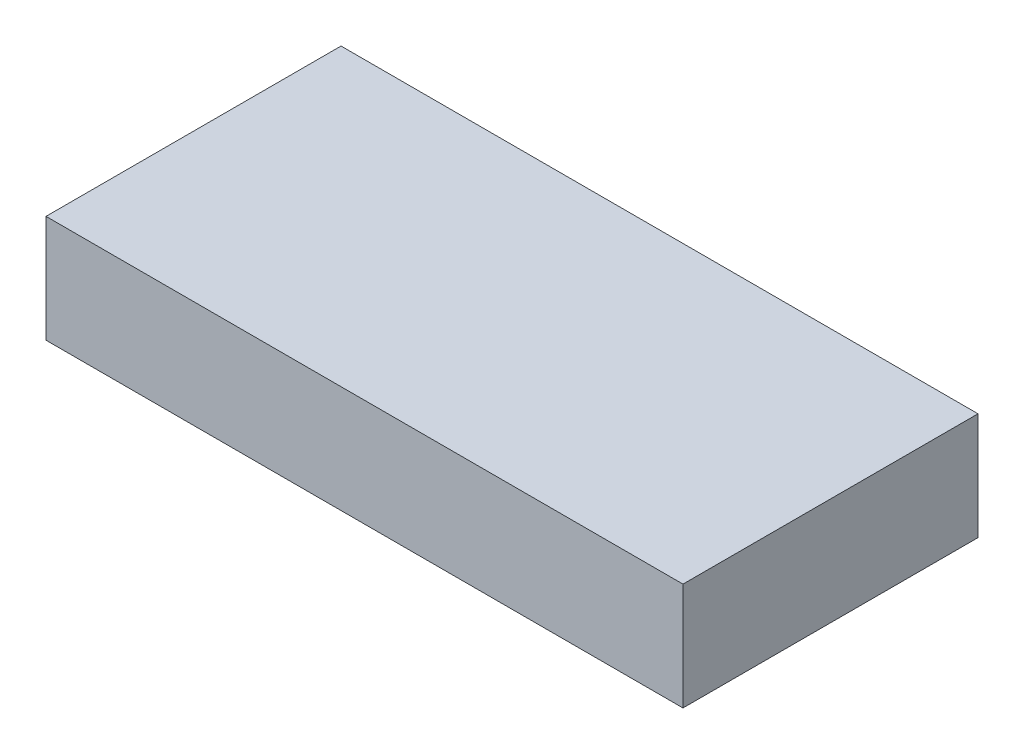
ISO-10303-21;
HEADER;
FILE_DESCRIPTION(('STEP AP214'),'2;1');
FILE_NAME('part.step','',(''),(''),'','','');
FILE_SCHEMA(('AUTOMOTIVE_DESIGN { 1 0 10303 214 1 1 1 1 }'));
ENDSEC;
DATA;
#1=APPLICATION_CONTEXT('core data for automotive mechanical design processes');
#2=APPLICATION_PROTOCOL_DEFINITION('international standard','automotive_design',2000,#1);
#3=PRODUCT_CONTEXT('',#1,'mechanical');
#4=PRODUCT('Part','Part','',(#3));
#5=PRODUCT_RELATED_PRODUCT_CATEGORY('part','',(#4));
#6=PRODUCT_DEFINITION_FORMATION('','',#4);
#7=PRODUCT_DEFINITION_CONTEXT('part definition',#1,'design');
#8=PRODUCT_DEFINITION('design','',#6,#7);
#9=PRODUCT_DEFINITION_SHAPE('','',#8);
#10=(LENGTH_UNIT() NAMED_UNIT(*) SI_UNIT(.MILLI.,.METRE.));
#11=(NAMED_UNIT(*) PLANE_ANGLE_UNIT() SI_UNIT($,.RADIAN.));
#12=(NAMED_UNIT(*) SI_UNIT($,.STERADIAN.) SOLID_ANGLE_UNIT());
#13=UNCERTAINTY_MEASURE_WITH_UNIT(LENGTH_MEASURE(1.E-05),#10,'distance_accuracy_value','');
#14=(GEOMETRIC_REPRESENTATION_CONTEXT(3) GLOBAL_UNCERTAINTY_ASSIGNED_CONTEXT((#13)) GLOBAL_UNIT_ASSIGNED_CONTEXT((#10,
#11,#12)) REPRESENTATION_CONTEXT('',''));
#15=CARTESIAN_POINT('',(0.,0.,0.));
#16=DIRECTION('',(0.,0.,1.));
#17=DIRECTION('',(1.,0.,0.));
#18=AXIS2_PLACEMENT_3D('',#15,#16,#17);
#19=CARTESIAN_POINT('',(47.5,16.,22.));
#20=DIRECTION('',(-1.,0.,0.));
#21=DIRECTION('',(0.,0.,1.));
#22=AXIS2_PLACEMENT_3D('',#19,#20,#21);
#23=PLANE('',#22);
#24=DIRECTION('',(0.,0.,-1.));
#25=VECTOR('',#24,1.);
#26=CARTESIAN_POINT('',(47.5,0.,22.));
#27=LINE('',#26,#25);
#28=CARTESIAN_POINT('',(47.5,0.,22.));
#29=VERTEX_POINT('',#28);
#30=CARTESIAN_POINT('',(47.5,0.,-22.));
#31=VERTEX_POINT('',#30);
#32=EDGE_CURVE('E102',#29,#31,#27,.T.);
#33=ORIENTED_EDGE('',*,*,#32,.T.);
#34=DIRECTION('',(0.,-1.,0.));
#35=VECTOR('',#34,1.);
#36=CARTESIAN_POINT('',(47.5,16.,-22.));
#37=LINE('',#36,#35);
#38=CARTESIAN_POINT('',(47.5,16.,-22.));
#39=VERTEX_POINT('',#38);
#40=EDGE_CURVE('E11',#39,#31,#37,.T.);
#41=ORIENTED_EDGE('',*,*,#40,.F.);
#42=DIRECTION('',(0.,0.,-1.));
#43=VECTOR('',#42,1.);
#44=CARTESIAN_POINT('',(47.5,16.,22.));
#45=LINE('',#44,#43);
#46=CARTESIAN_POINT('',(47.5,16.,22.));
#47=VERTEX_POINT('',#46);
#48=EDGE_CURVE('E90',#47,#39,#45,.T.);
#49=ORIENTED_EDGE('',*,*,#48,.F.);
#50=DIRECTION('',(0.,-1.,0.));
#51=VECTOR('',#50,1.);
#52=CARTESIAN_POINT('',(47.5,16.,22.));
#53=LINE('',#52,#51);
#54=EDGE_CURVE('E98',#47,#29,#53,.T.);
#55=ORIENTED_EDGE('',*,*,#54,.T.);
#56=EDGE_LOOP('',(#33,#41,#49,#55));
#57=FACE_BOUND('',#56,.T.);
#58=ADVANCED_FACE('F39',(#57),#23,.F.);
#59=CARTESIAN_POINT('',(-47.5,16.,-22.));
#60=DIRECTION('',(0.,0.,1.));
#61=DIRECTION('',(1.,0.,0.));
#62=AXIS2_PLACEMENT_3D('',#59,#60,#61);
#63=PLANE('',#62);
#64=DIRECTION('',(-1.,0.,0.));
#65=VECTOR('',#64,1.);
#66=CARTESIAN_POINT('',(-47.5,0.,-22.));
#67=LINE('',#66,#65);
#68=CARTESIAN_POINT('',(-47.5,0.,-22.));
#69=VERTEX_POINT('',#68);
#70=EDGE_CURVE('E94',#31,#69,#67,.T.);
#71=ORIENTED_EDGE('',*,*,#70,.T.);
#72=DIRECTION('',(0.,-1.,0.));
#73=VECTOR('',#72,1.);
#74=CARTESIAN_POINT('',(-47.5,16.,-22.));
#75=LINE('',#74,#73);
#76=CARTESIAN_POINT('',(-47.5,16.,-22.));
#77=VERTEX_POINT('',#76);
#78=EDGE_CURVE('E47',#77,#69,#75,.T.);
#79=ORIENTED_EDGE('',*,*,#78,.F.);
#80=DIRECTION('',(-1.,0.,0.));
#81=VECTOR('',#80,1.);
#82=CARTESIAN_POINT('',(-47.5,16.,-22.));
#83=LINE('',#82,#81);
#84=EDGE_CURVE('E85',#39,#77,#83,.T.);
#85=ORIENTED_EDGE('',*,*,#84,.F.);
#86=ORIENTED_EDGE('',*,*,#40,.T.);
#87=EDGE_LOOP('',(#71,#79,#85,#86));
#88=FACE_BOUND('',#87,.T.);
#89=ADVANCED_FACE('F93',(#88),#63,.F.);
#90=CARTESIAN_POINT('',(-47.5,16.,22.));
#91=DIRECTION('',(1.,0.,0.));
#92=DIRECTION('',(0.,0.,-1.));
#93=AXIS2_PLACEMENT_3D('',#90,#91,#92);
#94=PLANE('',#93);
#95=DIRECTION('',(0.,0.,1.));
#96=VECTOR('',#95,1.);
#97=CARTESIAN_POINT('',(-47.5,0.,22.));
#98=LINE('',#97,#96);
#99=CARTESIAN_POINT('',(-47.5,0.,22.));
#100=VERTEX_POINT('',#99);
#101=EDGE_CURVE('E72',#69,#100,#98,.T.);
#102=ORIENTED_EDGE('',*,*,#101,.T.);
#103=DIRECTION('',(0.,-1.,0.));
#104=VECTOR('',#103,1.);
#105=CARTESIAN_POINT('',(-47.5,16.,22.));
#106=LINE('',#105,#104);
#107=CARTESIAN_POINT('',(-47.5,16.,22.));
#108=VERTEX_POINT('',#107);
#109=EDGE_CURVE('E95',#108,#100,#106,.T.);
#110=ORIENTED_EDGE('',*,*,#109,.F.);
#111=DIRECTION('',(0.,0.,1.));
#112=VECTOR('',#111,1.);
#113=CARTESIAN_POINT('',(-47.5,16.,22.));
#114=LINE('',#113,#112);
#115=EDGE_CURVE('E88',#77,#108,#114,.T.);
#116=ORIENTED_EDGE('',*,*,#115,.F.);
#117=ORIENTED_EDGE('',*,*,#78,.T.);
#118=EDGE_LOOP('',(#102,#110,#116,#117));
#119=FACE_BOUND('',#118,.T.);
#120=ADVANCED_FACE('F96',(#119),#94,.F.);
#121=CARTESIAN_POINT('',(-47.5,16.,22.));
#122=DIRECTION('',(0.,0.,-1.));
#123=DIRECTION('',(-1.,0.,0.));
#124=AXIS2_PLACEMENT_3D('',#121,#122,#123);
#125=PLANE('',#124);
#126=DIRECTION('',(1.,0.,0.));
#127=VECTOR('',#126,1.);
#128=CARTESIAN_POINT('',(-47.5,0.,22.));
#129=LINE('',#128,#127);
#130=EDGE_CURVE('E78',#100,#29,#129,.T.);
#131=ORIENTED_EDGE('',*,*,#130,.T.);
#132=ORIENTED_EDGE('',*,*,#54,.F.);
#133=DIRECTION('',(1.,0.,0.));
#134=VECTOR('',#133,1.);
#135=CARTESIAN_POINT('',(-47.5,16.,22.));
#136=LINE('',#135,#134);
#137=EDGE_CURVE('E55',#108,#47,#136,.T.);
#138=ORIENTED_EDGE('',*,*,#137,.F.);
#139=ORIENTED_EDGE('',*,*,#109,.T.);
#140=EDGE_LOOP('',(#131,#132,#138,#139));
#141=FACE_BOUND('',#140,.T.);
#142=ADVANCED_FACE('F109',(#141),#125,.F.);
#143=CARTESIAN_POINT('',(0.,16.,0.));
#144=DIRECTION('',(0.,-1.,0.));
#145=DIRECTION('',(0.,0.,-1.));
#146=AXIS2_PLACEMENT_3D('',#143,#144,#145);
#147=PLANE('',#146);
#148=ORIENTED_EDGE('',*,*,#48,.T.);
#149=ORIENTED_EDGE('',*,*,#84,.T.);
#150=ORIENTED_EDGE('',*,*,#115,.T.);
#151=ORIENTED_EDGE('',*,*,#137,.T.);
#152=EDGE_LOOP('',(#148,#149,#150,#151));
#153=FACE_BOUND('',#152,.T.);
#154=ADVANCED_FACE('F86',(#153),#147,.F.);
#155=CARTESIAN_POINT('',(0.,0.,0.));
#156=DIRECTION('',(0.,-1.,0.));
#157=DIRECTION('',(0.,0.,-1.));
#158=AXIS2_PLACEMENT_3D('',#155,#156,#157);
#159=PLANE('',#158);
#160=ORIENTED_EDGE('',*,*,#32,.F.);
#161=ORIENTED_EDGE('',*,*,#130,.F.);
#162=ORIENTED_EDGE('',*,*,#101,.F.);
#163=ORIENTED_EDGE('',*,*,#70,.F.);
#164=EDGE_LOOP('',(#160,#161,#162,#163));
#165=FACE_BOUND('',#164,.T.);
#166=ADVANCED_FACE('F112',(#165),#159,.T.);
#167=CLOSED_SHELL('',(#58,#89,#120,#142,#154,#166));
#168=MANIFOLD_SOLID_BREP('B2',#167);
#169=ADVANCED_BREP_SHAPE_REPRESENTATION('',(#18,#168),#14);
#170=SHAPE_DEFINITION_REPRESENTATION(#9,#169);
ENDSEC;
END-ISO-10303-21;
